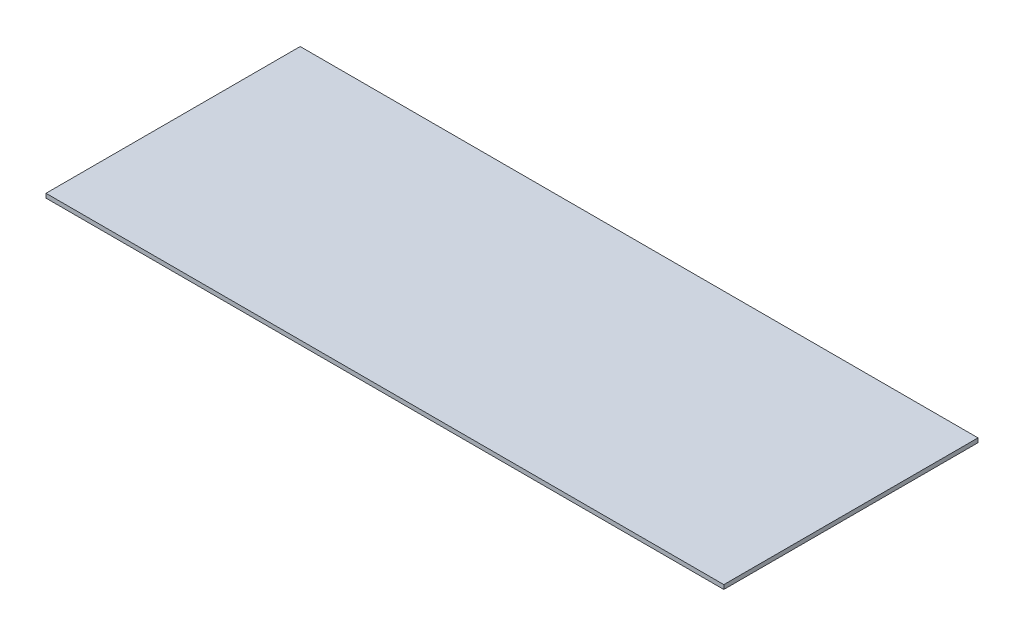
ISO-10303-21;
HEADER;
FILE_DESCRIPTION(('STEP AP214'),'2;1');
FILE_NAME('part.step','',(''),(''),'','','');
FILE_SCHEMA(('AUTOMOTIVE_DESIGN { 1 0 10303 214 1 1 1 1 }'));
ENDSEC;
DATA;
#1=APPLICATION_CONTEXT('core data for automotive mechanical design processes');
#2=APPLICATION_PROTOCOL_DEFINITION('international standard','automotive_design',2000,#1);
#3=PRODUCT_CONTEXT('',#1,'mechanical');
#4=PRODUCT('Part','Part','',(#3));
#5=PRODUCT_RELATED_PRODUCT_CATEGORY('part','',(#4));
#6=PRODUCT_DEFINITION_FORMATION('','',#4);
#7=PRODUCT_DEFINITION_CONTEXT('part definition',#1,'design');
#8=PRODUCT_DEFINITION('design','',#6,#7);
#9=PRODUCT_DEFINITION_SHAPE('','',#8);
#10=(LENGTH_UNIT() NAMED_UNIT(*) SI_UNIT(.MILLI.,.METRE.));
#11=(NAMED_UNIT(*) PLANE_ANGLE_UNIT() SI_UNIT($,.RADIAN.));
#12=(NAMED_UNIT(*) SI_UNIT($,.STERADIAN.) SOLID_ANGLE_UNIT());
#13=UNCERTAINTY_MEASURE_WITH_UNIT(LENGTH_MEASURE(1.E-05),#10,'distance_accuracy_value','');
#14=(GEOMETRIC_REPRESENTATION_CONTEXT(3) GLOBAL_UNCERTAINTY_ASSIGNED_CONTEXT((#13)) GLOBAL_UNIT_ASSIGNED_CONTEXT((#10,
#11,#12)) REPRESENTATION_CONTEXT('',''));
#15=CARTESIAN_POINT('',(0.,0.,0.));
#16=DIRECTION('',(0.,0.,1.));
#17=DIRECTION('',(1.,0.,0.));
#18=AXIS2_PLACEMENT_3D('',#15,#16,#17);
#19=CARTESIAN_POINT('',(0.,2.54,0.));
#20=DIRECTION('',(1.,0.,0.));
#21=DIRECTION('',(0.,0.,-1.));
#22=AXIS2_PLACEMENT_3D('',#19,#20,#21);
#23=PLANE('',#22);
#24=DIRECTION('',(0.,0.,1.));
#25=VECTOR('',#24,1.);
#26=CARTESIAN_POINT('',(0.,0.,0.));
#27=LINE('',#26,#25);
#28=CARTESIAN_POINT('',(0.,0.,0.));
#29=VERTEX_POINT('',#28);
#30=CARTESIAN_POINT('',(0.,0.,152.4));
#31=VERTEX_POINT('',#30);
#32=EDGE_CURVE('E96',#29,#31,#27,.T.);
#33=ORIENTED_EDGE('',*,*,#32,.T.);
#34=DIRECTION('',(0.,-1.,0.));
#35=VECTOR('',#34,1.);
#36=CARTESIAN_POINT('',(0.,2.54,152.4));
#37=LINE('',#36,#35);
#38=CARTESIAN_POINT('',(0.,2.54,152.4));
#39=VERTEX_POINT('',#38);
#40=EDGE_CURVE('E11',#39,#31,#37,.T.);
#41=ORIENTED_EDGE('',*,*,#40,.F.);
#42=DIRECTION('',(0.,0.,1.));
#43=VECTOR('',#42,1.);
#44=CARTESIAN_POINT('',(0.,2.54,0.));
#45=LINE('',#44,#43);
#46=CARTESIAN_POINT('',(0.,2.54,0.));
#47=VERTEX_POINT('',#46);
#48=EDGE_CURVE('E84',#47,#39,#45,.T.);
#49=ORIENTED_EDGE('',*,*,#48,.F.);
#50=DIRECTION('',(0.,-1.,0.));
#51=VECTOR('',#50,1.);
#52=CARTESIAN_POINT('',(0.,2.54,0.));
#53=LINE('',#52,#51);
#54=EDGE_CURVE('E92',#47,#29,#53,.T.);
#55=ORIENTED_EDGE('',*,*,#54,.T.);
#56=EDGE_LOOP('',(#33,#41,#49,#55));
#57=FACE_BOUND('',#56,.T.);
#58=ADVANCED_FACE('F33',(#57),#23,.F.);
#59=CARTESIAN_POINT('',(0.,2.54,152.4));
#60=DIRECTION('',(0.,0.,-1.));
#61=DIRECTION('',(-1.,0.,0.));
#62=AXIS2_PLACEMENT_3D('',#59,#60,#61);
#63=PLANE('',#62);
#64=DIRECTION('',(1.,0.,0.));
#65=VECTOR('',#64,1.);
#66=CARTESIAN_POINT('',(0.,0.,152.4));
#67=LINE('',#66,#65);
#68=CARTESIAN_POINT('',(406.4,0.,152.4));
#69=VERTEX_POINT('',#68);
#70=EDGE_CURVE('E88',#31,#69,#67,.T.);
#71=ORIENTED_EDGE('',*,*,#70,.T.);
#72=DIRECTION('',(0.,-1.,0.));
#73=VECTOR('',#72,1.);
#74=CARTESIAN_POINT('',(406.4,2.54,152.4));
#75=LINE('',#74,#73);
#76=CARTESIAN_POINT('',(406.4,2.54,152.4));
#77=VERTEX_POINT('',#76);
#78=EDGE_CURVE('E41',#77,#69,#75,.T.);
#79=ORIENTED_EDGE('',*,*,#78,.F.);
#80=DIRECTION('',(1.,0.,0.));
#81=VECTOR('',#80,1.);
#82=CARTESIAN_POINT('',(0.,2.54,152.4));
#83=LINE('',#82,#81);
#84=EDGE_CURVE('E79',#39,#77,#83,.T.);
#85=ORIENTED_EDGE('',*,*,#84,.F.);
#86=ORIENTED_EDGE('',*,*,#40,.T.);
#87=EDGE_LOOP('',(#71,#79,#85,#86));
#88=FACE_BOUND('',#87,.T.);
#89=ADVANCED_FACE('F87',(#88),#63,.F.);
#90=CARTESIAN_POINT('',(406.4,2.54,0.));
#91=DIRECTION('',(-1.,0.,0.));
#92=DIRECTION('',(0.,0.,1.));
#93=AXIS2_PLACEMENT_3D('',#90,#91,#92);
#94=PLANE('',#93);
#95=DIRECTION('',(0.,0.,-1.));
#96=VECTOR('',#95,1.);
#97=CARTESIAN_POINT('',(406.4,0.,0.));
#98=LINE('',#97,#96);
#99=CARTESIAN_POINT('',(406.4,0.,0.));
#100=VERTEX_POINT('',#99);
#101=EDGE_CURVE('E66',#69,#100,#98,.T.);
#102=ORIENTED_EDGE('',*,*,#101,.T.);
#103=DIRECTION('',(0.,-1.,0.));
#104=VECTOR('',#103,1.);
#105=CARTESIAN_POINT('',(406.4,2.54,0.));
#106=LINE('',#105,#104);
#107=CARTESIAN_POINT('',(406.4,2.54,0.));
#108=VERTEX_POINT('',#107);
#109=EDGE_CURVE('E89',#108,#100,#106,.T.);
#110=ORIENTED_EDGE('',*,*,#109,.F.);
#111=DIRECTION('',(0.,0.,-1.));
#112=VECTOR('',#111,1.);
#113=CARTESIAN_POINT('',(406.4,2.54,0.));
#114=LINE('',#113,#112);
#115=EDGE_CURVE('E82',#77,#108,#114,.T.);
#116=ORIENTED_EDGE('',*,*,#115,.F.);
#117=ORIENTED_EDGE('',*,*,#78,.T.);
#118=EDGE_LOOP('',(#102,#110,#116,#117));
#119=FACE_BOUND('',#118,.T.);
#120=ADVANCED_FACE('F90',(#119),#94,.F.);
#121=CARTESIAN_POINT('',(0.,2.54,0.));
#122=DIRECTION('',(0.,0.,1.));
#123=DIRECTION('',(1.,0.,0.));
#124=AXIS2_PLACEMENT_3D('',#121,#122,#123);
#125=PLANE('',#124);
#126=DIRECTION('',(-1.,0.,0.));
#127=VECTOR('',#126,1.);
#128=CARTESIAN_POINT('',(0.,0.,0.));
#129=LINE('',#128,#127);
#130=EDGE_CURVE('E72',#100,#29,#129,.T.);
#131=ORIENTED_EDGE('',*,*,#130,.T.);
#132=ORIENTED_EDGE('',*,*,#54,.F.);
#133=DIRECTION('',(-1.,0.,0.));
#134=VECTOR('',#133,1.);
#135=CARTESIAN_POINT('',(0.,2.54,0.));
#136=LINE('',#135,#134);
#137=EDGE_CURVE('E49',#108,#47,#136,.T.);
#138=ORIENTED_EDGE('',*,*,#137,.F.);
#139=ORIENTED_EDGE('',*,*,#109,.T.);
#140=EDGE_LOOP('',(#131,#132,#138,#139));
#141=FACE_BOUND('',#140,.T.);
#142=ADVANCED_FACE('F103',(#141),#125,.F.);
#143=CARTESIAN_POINT('',(0.,2.54,0.));
#144=DIRECTION('',(0.,1.,0.));
#145=DIRECTION('',(0.,0.,1.));
#146=AXIS2_PLACEMENT_3D('',#143,#144,#145);
#147=PLANE('',#146);
#148=ORIENTED_EDGE('',*,*,#48,.T.);
#149=ORIENTED_EDGE('',*,*,#84,.T.);
#150=ORIENTED_EDGE('',*,*,#115,.T.);
#151=ORIENTED_EDGE('',*,*,#137,.T.);
#152=EDGE_LOOP('',(#148,#149,#150,#151));
#153=FACE_BOUND('',#152,.T.);
#154=ADVANCED_FACE('F80',(#153),#147,.T.);
#155=CARTESIAN_POINT('',(0.,0.,0.));
#156=DIRECTION('',(0.,1.,0.));
#157=DIRECTION('',(0.,0.,1.));
#158=AXIS2_PLACEMENT_3D('',#155,#156,#157);
#159=PLANE('',#158);
#160=ORIENTED_EDGE('',*,*,#32,.F.);
#161=ORIENTED_EDGE('',*,*,#130,.F.);
#162=ORIENTED_EDGE('',*,*,#101,.F.);
#163=ORIENTED_EDGE('',*,*,#70,.F.);
#164=EDGE_LOOP('',(#160,#161,#162,#163));
#165=FACE_BOUND('',#164,.T.);
#166=ADVANCED_FACE('F106',(#165),#159,.F.);
#167=CLOSED_SHELL('',(#58,#89,#120,#142,#154,#166));
#168=MANIFOLD_SOLID_BREP('B2',#167);
#169=ADVANCED_BREP_SHAPE_REPRESENTATION('',(#18,#168),#14);
#170=SHAPE_DEFINITION_REPRESENTATION(#9,#169);
ENDSEC;
END-ISO-10303-21;
